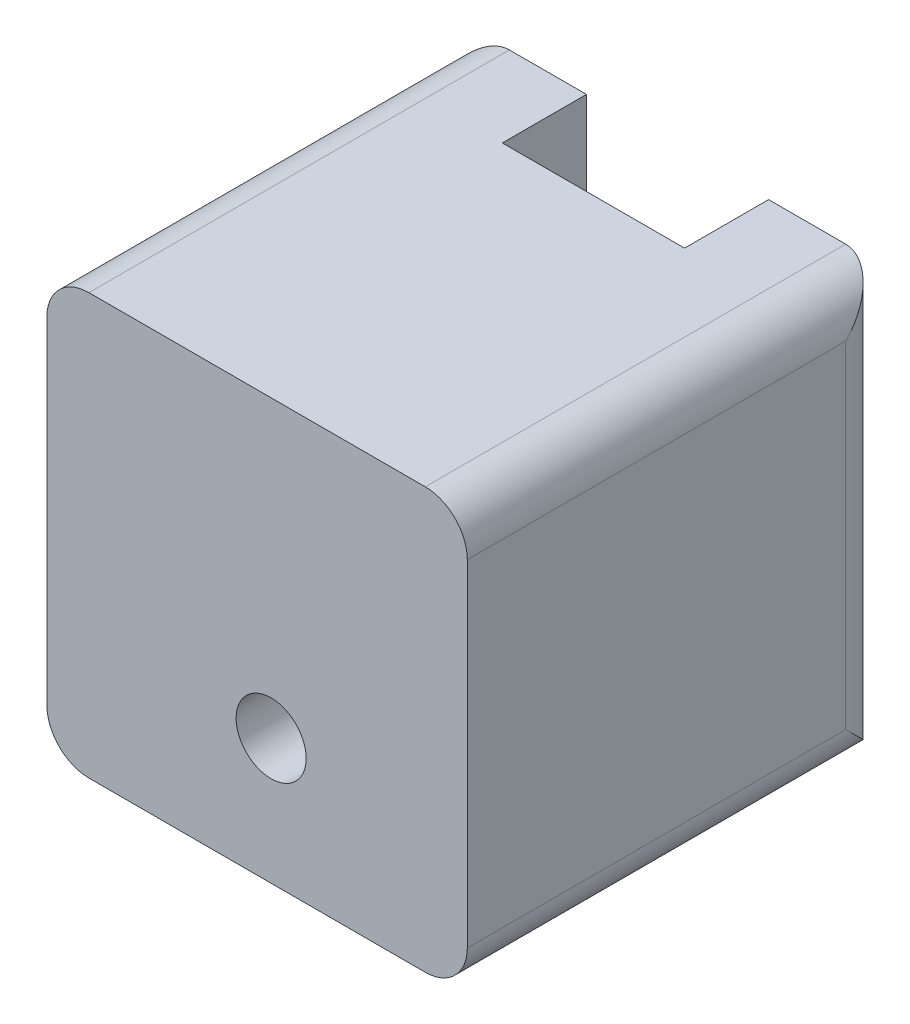
ISO-10303-21;
HEADER;
FILE_DESCRIPTION(('STEP AP214'),'2;1');
FILE_NAME('part.step','',(''),(''),'','','');
FILE_SCHEMA(('AUTOMOTIVE_DESIGN { 1 0 10303 214 1 1 1 1 }'));
ENDSEC;
DATA;
#1=APPLICATION_CONTEXT('core data for automotive mechanical design processes');
#2=APPLICATION_PROTOCOL_DEFINITION('international standard','automotive_design',2000,#1);
#3=PRODUCT_CONTEXT('',#1,'mechanical');
#4=PRODUCT('Part','Part','',(#3));
#5=PRODUCT_RELATED_PRODUCT_CATEGORY('part','',(#4));
#6=PRODUCT_DEFINITION_FORMATION('','',#4);
#7=PRODUCT_DEFINITION_CONTEXT('part definition',#1,'design');
#8=PRODUCT_DEFINITION('design','',#6,#7);
#9=PRODUCT_DEFINITION_SHAPE('','',#8);
#10=(LENGTH_UNIT() NAMED_UNIT(*) SI_UNIT(.MILLI.,.METRE.));
#11=(NAMED_UNIT(*) PLANE_ANGLE_UNIT() SI_UNIT($,.RADIAN.));
#12=(NAMED_UNIT(*) SI_UNIT($,.STERADIAN.) SOLID_ANGLE_UNIT());
#13=UNCERTAINTY_MEASURE_WITH_UNIT(LENGTH_MEASURE(1.E-05),#10,'distance_accuracy_value','');
#14=(GEOMETRIC_REPRESENTATION_CONTEXT(3) GLOBAL_UNCERTAINTY_ASSIGNED_CONTEXT((#13)) GLOBAL_UNIT_ASSIGNED_CONTEXT((#10,
#11,#12)) REPRESENTATION_CONTEXT('',''));
#15=CARTESIAN_POINT('',(0.,0.,0.));
#16=DIRECTION('',(0.,0.,1.));
#17=DIRECTION('',(1.,0.,0.));
#18=AXIS2_PLACEMENT_3D('',#15,#16,#17);
#19=CARTESIAN_POINT('',(0.,0.,0.));
#20=DIRECTION('',(0.,0.,-1.));
#21=DIRECTION('',(-1.,0.,0.));
#22=AXIS2_PLACEMENT_3D('',#19,#20,#21);
#23=PLANE('',#22);
#24=DIRECTION('',(1.,0.,0.));
#25=VECTOR('',#24,1.);
#26=CARTESIAN_POINT('',(0.,-30.,0.));
#27=LINE('',#26,#25);
#28=CARTESIAN_POINT('',(-27.,-30.,0.));
#29=VERTEX_POINT('',#28);
#30=CARTESIAN_POINT('',(-21.5,-30.,0.));
#31=VERTEX_POINT('',#30);
#32=EDGE_CURVE('E229',#29,#31,#27,.T.);
#33=ORIENTED_EDGE('',*,*,#32,.F.);
#34=DIRECTION('',(0.,-1.,0.));
#35=VECTOR('',#34,1.);
#36=CARTESIAN_POINT('',(-27.,0.,0.));
#37=LINE('',#36,#35);
#38=CARTESIAN_POINT('',(-27.,0.,0.));
#39=VERTEX_POINT('',#38);
#40=EDGE_CURVE('E11',#29,#39,#37,.F.);
#41=ORIENTED_EDGE('',*,*,#40,.T.);
#42=DIRECTION('',(-1.,0.,0.));
#43=VECTOR('',#42,1.);
#44=CARTESIAN_POINT('',(0.,0.,0.));
#45=LINE('',#44,#43);
#46=CARTESIAN_POINT('',(-21.5,0.,0.));
#47=VERTEX_POINT('',#46);
#48=EDGE_CURVE('E214',#47,#39,#45,.T.);
#49=ORIENTED_EDGE('',*,*,#48,.F.);
#50=DIRECTION('',(0.,1.,0.));
#51=VECTOR('',#50,1.);
#52=CARTESIAN_POINT('',(-21.5,0.,0.));
#53=LINE('',#52,#51);
#54=EDGE_CURVE('E190',#31,#47,#53,.T.);
#55=ORIENTED_EDGE('',*,*,#54,.F.);
#56=EDGE_LOOP('',(#33,#41,#49,#55));
#57=FACE_BOUND('',#56,.T.);
#58=ADVANCED_FACE('F39',(#57),#23,.T.);
#59=CARTESIAN_POINT('',(0.,0.,30.));
#60=DIRECTION('',(-1.,0.,0.));
#61=DIRECTION('',(0.,0.,1.));
#62=AXIS2_PLACEMENT_3D('',#59,#60,#61);
#63=PLANE('',#62);
#64=DIRECTION('',(0.,1.,0.));
#65=VECTOR('',#64,1.);
#66=CARTESIAN_POINT('',(0.,0.,3.));
#67=LINE('',#66,#65);
#68=CARTESIAN_POINT('',(0.,-27.,3.));
#69=VERTEX_POINT('',#68);
#70=CARTESIAN_POINT('',(0.,-3.,3.));
#71=VERTEX_POINT('',#70);
#72=EDGE_CURVE('E254',#69,#71,#67,.T.);
#73=ORIENTED_EDGE('',*,*,#72,.T.);
#74=DIRECTION('',(0.,0.,-1.));
#75=VECTOR('',#74,1.);
#76=CARTESIAN_POINT('',(0.,-3.,30.));
#77=LINE('',#76,#75);
#78=CARTESIAN_POINT('',(0.,-3.,30.));
#79=VERTEX_POINT('',#78);
#80=EDGE_CURVE('E260',#71,#79,#77,.F.);
#81=ORIENTED_EDGE('',*,*,#80,.T.);
#82=DIRECTION('',(0.,1.,0.));
#83=VECTOR('',#82,1.);
#84=CARTESIAN_POINT('',(0.,0.,30.));
#85=LINE('',#84,#83);
#86=CARTESIAN_POINT('',(0.,-27.,30.));
#87=VERTEX_POINT('',#86);
#88=EDGE_CURVE('E224',#87,#79,#85,.T.);
#89=ORIENTED_EDGE('',*,*,#88,.F.);
#90=DIRECTION('',(0.,0.,-1.));
#91=VECTOR('',#90,1.);
#92=CARTESIAN_POINT('',(0.,-27.,30.));
#93=LINE('',#92,#91);
#94=EDGE_CURVE('E257',#87,#69,#93,.T.);
#95=ORIENTED_EDGE('',*,*,#94,.T.);
#96=EDGE_LOOP('',(#73,#81,#89,#95));
#97=FACE_BOUND('',#96,.T.);
#98=ADVANCED_FACE('F383',(#97),#63,.F.);
#99=CARTESIAN_POINT('',(0.,0.,30.));
#100=DIRECTION('',(0.,-1.,0.));
#101=DIRECTION('',(1.,0.,0.));
#102=AXIS2_PLACEMENT_3D('',#99,#100,#101);
#103=PLANE('',#102);
#104=DIRECTION('',(-1.,0.,0.));
#105=VECTOR('',#104,1.);
#106=CARTESIAN_POINT('',(0.,0.,30.));
#107=LINE('',#106,#105);
#108=CARTESIAN_POINT('',(-3.,0.,30.));
#109=VERTEX_POINT('',#108);
#110=CARTESIAN_POINT('',(-27.,0.,30.));
#111=VERTEX_POINT('',#110);
#112=EDGE_CURVE('E228',#109,#111,#107,.T.);
#113=ORIENTED_EDGE('',*,*,#112,.F.);
#114=DIRECTION('',(0.,0.,-1.));
#115=VECTOR('',#114,1.);
#116=CARTESIAN_POINT('',(-3.,0.,30.));
#117=LINE('',#116,#115);
#118=CARTESIAN_POINT('',(-3.,0.,0.));
#119=VERTEX_POINT('',#118);
#120=EDGE_CURVE('E250',#109,#119,#117,.T.);
#121=ORIENTED_EDGE('',*,*,#120,.T.);
#122=CARTESIAN_POINT('',(-8.5,0.,0.));
#123=VERTEX_POINT('',#122);
#124=EDGE_CURVE('E242',#119,#123,#45,.T.);
#125=ORIENTED_EDGE('',*,*,#124,.T.);
#126=DIRECTION('',(0.,0.,-1.));
#127=VECTOR('',#126,1.);
#128=CARTESIAN_POINT('',(-8.5,0.,6.));
#129=LINE('',#128,#127);
#130=CARTESIAN_POINT('',(-8.5,0.,6.));
#131=VERTEX_POINT('',#130);
#132=EDGE_CURVE('E210',#131,#123,#129,.T.);
#133=ORIENTED_EDGE('',*,*,#132,.F.);
#134=DIRECTION('',(1.,0.,0.));
#135=VECTOR('',#134,1.);
#136=CARTESIAN_POINT('',(-8.5,0.,6.));
#137=LINE('',#136,#135);
#138=CARTESIAN_POINT('',(-21.5,0.,6.));
#139=VERTEX_POINT('',#138);
#140=EDGE_CURVE('E198',#139,#131,#137,.T.);
#141=ORIENTED_EDGE('',*,*,#140,.F.);
#142=DIRECTION('',(0.,0.,-1.));
#143=VECTOR('',#142,1.);
#144=CARTESIAN_POINT('',(-21.5,0.,6.));
#145=LINE('',#144,#143);
#146=EDGE_CURVE('E215',#139,#47,#145,.T.);
#147=ORIENTED_EDGE('',*,*,#146,.T.);
#148=ORIENTED_EDGE('',*,*,#48,.T.);
#149=DIRECTION('',(0.,0.,-1.));
#150=VECTOR('',#149,1.);
#151=CARTESIAN_POINT('',(-27.,0.,30.));
#152=LINE('',#151,#150);
#153=EDGE_CURVE('E241',#39,#111,#152,.F.);
#154=ORIENTED_EDGE('',*,*,#153,.T.);
#155=EDGE_LOOP('',(#113,#121,#125,#133,#141,#147,#148,#154));
#156=FACE_BOUND('',#155,.T.);
#157=ADVANCED_FACE('F325',(#156),#103,.F.);
#158=CARTESIAN_POINT('',(-30.,0.,30.));
#159=DIRECTION('',(1.,0.,0.));
#160=DIRECTION('',(0.,1.,0.));
#161=AXIS2_PLACEMENT_3D('',#158,#159,#160);
#162=PLANE('',#161);
#163=DIRECTION('',(0.,-1.,0.));
#164=VECTOR('',#163,1.);
#165=CARTESIAN_POINT('',(-30.,0.,30.));
#166=LINE('',#165,#164);
#167=CARTESIAN_POINT('',(-30.,-3.,30.));
#168=VERTEX_POINT('',#167);
#169=CARTESIAN_POINT('',(-30.,-27.,30.));
#170=VERTEX_POINT('',#169);
#171=EDGE_CURVE('E233',#168,#170,#166,.T.);
#172=ORIENTED_EDGE('',*,*,#171,.F.);
#173=DIRECTION('',(0.,0.,-1.));
#174=VECTOR('',#173,1.);
#175=CARTESIAN_POINT('',(-30.,-3.,30.));
#176=LINE('',#175,#174);
#177=CARTESIAN_POINT('',(-30.,-3.,3.));
#178=VERTEX_POINT('',#177);
#179=EDGE_CURVE('E281',#168,#178,#176,.T.);
#180=ORIENTED_EDGE('',*,*,#179,.T.);
#181=DIRECTION('',(0.,-1.,0.));
#182=VECTOR('',#181,1.);
#183=CARTESIAN_POINT('',(-30.,-30.,3.));
#184=LINE('',#183,#182);
#185=CARTESIAN_POINT('',(-30.,-27.,3.));
#186=VERTEX_POINT('',#185);
#187=EDGE_CURVE('E275',#178,#186,#184,.T.);
#188=ORIENTED_EDGE('',*,*,#187,.T.);
#189=DIRECTION('',(0.,0.,-1.));
#190=VECTOR('',#189,1.);
#191=CARTESIAN_POINT('',(-30.,-27.,30.));
#192=LINE('',#191,#190);
#193=EDGE_CURVE('E278',#186,#170,#192,.F.);
#194=ORIENTED_EDGE('',*,*,#193,.T.);
#195=EDGE_LOOP('',(#172,#180,#188,#194));
#196=FACE_BOUND('',#195,.T.);
#197=ADVANCED_FACE('F317',(#196),#162,.F.);
#198=CARTESIAN_POINT('',(0.,-30.,30.));
#199=DIRECTION('',(0.,1.,0.));
#200=DIRECTION('',(-1.,0.,0.));
#201=AXIS2_PLACEMENT_3D('',#198,#199,#200);
#202=PLANE('',#201);
#203=CARTESIAN_POINT('',(-18.,-30.,0.));
#204=VERTEX_POINT('',#203);
#205=CARTESIAN_POINT('',(-3.,-30.,0.));
#206=VERTEX_POINT('',#205);
#207=EDGE_CURVE('E245',#204,#206,#27,.T.);
#208=ORIENTED_EDGE('',*,*,#207,.T.);
#209=DIRECTION('',(0.,0.,-1.));
#210=VECTOR('',#209,1.);
#211=CARTESIAN_POINT('',(-3.,-30.,30.));
#212=LINE('',#211,#210);
#213=CARTESIAN_POINT('',(-3.,-30.,30.));
#214=VERTEX_POINT('',#213);
#215=EDGE_CURVE('E287',#206,#214,#212,.F.);
#216=ORIENTED_EDGE('',*,*,#215,.T.);
#217=DIRECTION('',(1.,0.,0.));
#218=VECTOR('',#217,1.);
#219=CARTESIAN_POINT('',(0.,-30.,30.));
#220=LINE('',#219,#218);
#221=CARTESIAN_POINT('',(-27.,-30.,30.));
#222=VERTEX_POINT('',#221);
#223=EDGE_CURVE('E237',#222,#214,#220,.T.);
#224=ORIENTED_EDGE('',*,*,#223,.F.);
#225=DIRECTION('',(0.,0.,-1.));
#226=VECTOR('',#225,1.);
#227=CARTESIAN_POINT('',(-27.,-30.,30.));
#228=LINE('',#227,#226);
#229=EDGE_CURVE('E64',#222,#29,#228,.T.);
#230=ORIENTED_EDGE('',*,*,#229,.T.);
#231=ORIENTED_EDGE('',*,*,#32,.T.);
#232=DIRECTION('',(0.,0.,-1.));
#233=VECTOR('',#232,1.);
#234=CARTESIAN_POINT('',(-21.5,-30.,3.));
#235=LINE('',#234,#233);
#236=CARTESIAN_POINT('',(-21.5,-30.,3.));
#237=VERTEX_POINT('',#236);
#238=EDGE_CURVE('E180',#237,#31,#235,.T.);
#239=ORIENTED_EDGE('',*,*,#238,.F.);
#240=DIRECTION('',(-1.,0.,0.));
#241=VECTOR('',#240,1.);
#242=CARTESIAN_POINT('',(-21.5,-30.,3.));
#243=LINE('',#242,#241);
#244=CARTESIAN_POINT('',(-18.,-30.,3.));
#245=VERTEX_POINT('',#244);
#246=EDGE_CURVE('E161',#245,#237,#243,.T.);
#247=ORIENTED_EDGE('',*,*,#246,.F.);
#248=DIRECTION('',(0.,0.,-1.));
#249=VECTOR('',#248,1.);
#250=CARTESIAN_POINT('',(-18.,-30.,3.));
#251=LINE('',#250,#249);
#252=EDGE_CURVE('E156',#245,#204,#251,.T.);
#253=ORIENTED_EDGE('',*,*,#252,.T.);
#254=EDGE_LOOP('',(#208,#216,#224,#230,#231,#239,#247,#253));
#255=FACE_BOUND('',#254,.T.);
#256=ADVANCED_FACE('F371',(#255),#202,.F.);
#257=CARTESIAN_POINT('',(0.,0.,30.));
#258=DIRECTION('',(0.,0.,-1.));
#259=DIRECTION('',(-1.,0.,0.));
#260=AXIS2_PLACEMENT_3D('',#257,#258,#259);
#261=PLANE('',#260);
#262=CARTESIAN_POINT('',(-14.,-21.0389605122577,30.));
#263=DIRECTION('',(0.,0.,-1.));
#264=DIRECTION('',(-1.,0.,0.));
#265=AXIS2_PLACEMENT_3D('',#262,#263,#264);
#266=CIRCLE('',#265,2.5);
#267=CARTESIAN_POINT('',(-16.5,-21.0389605122577,30.));
#268=VERTEX_POINT('',#267);
#269=EDGE_CURVE('E340',#268,#268,#266,.T.);
#270=ORIENTED_EDGE('',*,*,#269,.T.);
#271=EDGE_LOOP('',(#270));
#272=FACE_BOUND('',#271,.T.);
#273=ORIENTED_EDGE('',*,*,#88,.T.);
#274=CARTESIAN_POINT('',(-3.,-3.,30.));
#275=DIRECTION('',(0.,0.,-1.));
#276=DIRECTION('',(-1.,0.,0.));
#277=AXIS2_PLACEMENT_3D('',#274,#275,#276);
#278=CIRCLE('',#277,3.);
#279=EDGE_CURVE('E272',#79,#109,#278,.F.);
#280=ORIENTED_EDGE('',*,*,#279,.T.);
#281=ORIENTED_EDGE('',*,*,#112,.T.);
#282=CARTESIAN_POINT('',(-27.,-3.,30.));
#283=DIRECTION('',(0.,0.,-1.));
#284=DIRECTION('',(-1.,0.,0.));
#285=AXIS2_PLACEMENT_3D('',#282,#283,#284);
#286=CIRCLE('',#285,3.);
#287=EDGE_CURVE('E269',#111,#168,#286,.F.);
#288=ORIENTED_EDGE('',*,*,#287,.T.);
#289=ORIENTED_EDGE('',*,*,#171,.T.);
#290=CARTESIAN_POINT('',(-27.,-27.,30.));
#291=DIRECTION('',(0.,0.,-1.));
#292=DIRECTION('',(-1.,0.,0.));
#293=AXIS2_PLACEMENT_3D('',#290,#291,#292);
#294=CIRCLE('',#293,3.);
#295=EDGE_CURVE('E263',#170,#222,#294,.F.);
#296=ORIENTED_EDGE('',*,*,#295,.T.);
#297=ORIENTED_EDGE('',*,*,#223,.T.);
#298=CARTESIAN_POINT('',(-3.,-27.,30.));
#299=DIRECTION('',(0.,0.,-1.));
#300=DIRECTION('',(-1.,0.,0.));
#301=AXIS2_PLACEMENT_3D('',#298,#299,#300);
#302=CIRCLE('',#301,3.);
#303=EDGE_CURVE('E266',#214,#87,#302,.F.);
#304=ORIENTED_EDGE('',*,*,#303,.T.);
#305=EDGE_LOOP('',(#273,#280,#281,#288,#289,#296,#297,#304));
#306=FACE_BOUND('',#305,.T.);
#307=ADVANCED_FACE('F319',(#272,#306),#261,.F.);
#308=CARTESIAN_POINT('',(-14.,-21.0389605122577,0.));
#309=DIRECTION('',(0.,0.,-1.));
#310=DIRECTION('',(-1.,0.,0.));
#311=AXIS2_PLACEMENT_3D('',#308,#309,#310);
#312=CIRCLE('',#311,2.5);
#313=CARTESIAN_POINT('',(-16.5,-21.0389605122577,0.));
#314=VERTEX_POINT('',#313);
#315=EDGE_CURVE('E298',#314,#314,#312,.T.);
#316=ORIENTED_EDGE('',*,*,#315,.F.);
#317=EDGE_LOOP('',(#316));
#318=FACE_BOUND('',#317,.T.);
#319=ORIENTED_EDGE('',*,*,#124,.F.);
#320=DIRECTION('',(0.,1.,0.));
#321=VECTOR('',#320,1.);
#322=CARTESIAN_POINT('',(-3.,-30.,0.));
#323=LINE('',#322,#321);
#324=EDGE_CURVE('E49',#119,#206,#323,.F.);
#325=ORIENTED_EDGE('',*,*,#324,.T.);
#326=ORIENTED_EDGE('',*,*,#207,.F.);
#327=DIRECTION('',(0.,-1.,0.));
#328=VECTOR('',#327,1.);
#329=CARTESIAN_POINT('',(-18.,-15.,0.));
#330=LINE('',#329,#328);
#331=CARTESIAN_POINT('',(-18.,-15.,0.));
#332=VERTEX_POINT('',#331);
#333=EDGE_CURVE('E338',#332,#204,#330,.T.);
#334=ORIENTED_EDGE('',*,*,#333,.F.);
#335=DIRECTION('',(-1.,0.,0.));
#336=VECTOR('',#335,1.);
#337=CARTESIAN_POINT('',(-8.5,-15.,0.));
#338=LINE('',#337,#336);
#339=CARTESIAN_POINT('',(-8.5,-15.,0.));
#340=VERTEX_POINT('',#339);
#341=EDGE_CURVE('E175',#340,#332,#338,.T.);
#342=ORIENTED_EDGE('',*,*,#341,.F.);
#343=DIRECTION('',(0.,-1.,0.));
#344=VECTOR('',#343,1.);
#345=CARTESIAN_POINT('',(-8.5,0.,0.));
#346=LINE('',#345,#344);
#347=EDGE_CURVE('E203',#123,#340,#346,.T.);
#348=ORIENTED_EDGE('',*,*,#347,.F.);
#349=EDGE_LOOP('',(#319,#325,#326,#334,#342,#348));
#350=FACE_BOUND('',#349,.T.);
#351=ADVANCED_FACE('F359',(#318,#350),#23,.T.);
#352=CARTESIAN_POINT('',(-8.5,0.,6.));
#353=DIRECTION('',(1.,0.,0.));
#354=DIRECTION('',(0.,1.,0.));
#355=AXIS2_PLACEMENT_3D('',#352,#353,#354);
#356=PLANE('',#355);
#357=ORIENTED_EDGE('',*,*,#347,.T.);
#358=DIRECTION('',(0.,0.,-1.));
#359=VECTOR('',#358,1.);
#360=CARTESIAN_POINT('',(-8.5,-15.,6.));
#361=LINE('',#360,#359);
#362=CARTESIAN_POINT('',(-8.5,-15.,6.));
#363=VERTEX_POINT('',#362);
#364=EDGE_CURVE('E202',#363,#340,#361,.T.);
#365=ORIENTED_EDGE('',*,*,#364,.F.);
#366=DIRECTION('',(0.,-1.,0.));
#367=VECTOR('',#366,1.);
#368=CARTESIAN_POINT('',(-8.5,0.,6.));
#369=LINE('',#368,#367);
#370=EDGE_CURVE('E185',#131,#363,#369,.T.);
#371=ORIENTED_EDGE('',*,*,#370,.F.);
#372=ORIENTED_EDGE('',*,*,#132,.T.);
#373=EDGE_LOOP('',(#357,#365,#371,#372));
#374=FACE_BOUND('',#373,.T.);
#375=ADVANCED_FACE('F361',(#374),#356,.F.);
#376=CARTESIAN_POINT('',(-21.5,0.,6.));
#377=DIRECTION('',(-1.,0.,0.));
#378=DIRECTION('',(0.,-1.,0.));
#379=AXIS2_PLACEMENT_3D('',#376,#377,#378);
#380=PLANE('',#379);
#381=ORIENTED_EDGE('',*,*,#54,.T.);
#382=ORIENTED_EDGE('',*,*,#146,.F.);
#383=DIRECTION('',(0.,1.,0.));
#384=VECTOR('',#383,1.);
#385=CARTESIAN_POINT('',(-21.5,0.,6.));
#386=LINE('',#385,#384);
#387=CARTESIAN_POINT('',(-21.5,-15.,6.));
#388=VERTEX_POINT('',#387);
#389=EDGE_CURVE('E194',#388,#139,#386,.T.);
#390=ORIENTED_EDGE('',*,*,#389,.F.);
#391=DIRECTION('',(0.,0.,-1.));
#392=VECTOR('',#391,1.);
#393=CARTESIAN_POINT('',(-21.5,-15.,6.));
#394=LINE('',#393,#392);
#395=CARTESIAN_POINT('',(-21.5,-15.,3.));
#396=VERTEX_POINT('',#395);
#397=EDGE_CURVE('E219',#388,#396,#394,.T.);
#398=ORIENTED_EDGE('',*,*,#397,.T.);
#399=DIRECTION('',(0.,1.,0.));
#400=VECTOR('',#399,1.);
#401=CARTESIAN_POINT('',(-21.5,-15.,3.));
#402=LINE('',#401,#400);
#403=EDGE_CURVE('E166',#237,#396,#402,.T.);
#404=ORIENTED_EDGE('',*,*,#403,.F.);
#405=ORIENTED_EDGE('',*,*,#238,.T.);
#406=EDGE_LOOP('',(#381,#382,#390,#398,#404,#405));
#407=FACE_BOUND('',#406,.T.);
#408=ADVANCED_FACE('F370',(#407),#380,.F.);
#409=CARTESIAN_POINT('',(-8.5,-15.,6.));
#410=DIRECTION('',(0.,-1.,0.));
#411=DIRECTION('',(1.,0.,0.));
#412=AXIS2_PLACEMENT_3D('',#409,#410,#411);
#413=PLANE('',#412);
#414=ORIENTED_EDGE('',*,*,#341,.T.);
#415=DIRECTION('',(0.,0.,-1.));
#416=VECTOR('',#415,1.);
#417=CARTESIAN_POINT('',(-18.,-15.,3.));
#418=LINE('',#417,#416);
#419=CARTESIAN_POINT('',(-18.,-15.,3.));
#420=VERTEX_POINT('',#419);
#421=EDGE_CURVE('E153',#420,#332,#418,.T.);
#422=ORIENTED_EDGE('',*,*,#421,.F.);
#423=DIRECTION('',(1.,0.,0.));
#424=VECTOR('',#423,1.);
#425=CARTESIAN_POINT('',(-21.5,-15.,3.));
#426=LINE('',#425,#424);
#427=EDGE_CURVE('E162',#396,#420,#426,.T.);
#428=ORIENTED_EDGE('',*,*,#427,.F.);
#429=ORIENTED_EDGE('',*,*,#397,.F.);
#430=DIRECTION('',(-1.,0.,0.));
#431=VECTOR('',#430,1.);
#432=CARTESIAN_POINT('',(-8.5,-15.,6.));
#433=LINE('',#432,#431);
#434=EDGE_CURVE('E189',#363,#388,#433,.T.);
#435=ORIENTED_EDGE('',*,*,#434,.F.);
#436=ORIENTED_EDGE('',*,*,#364,.T.);
#437=EDGE_LOOP('',(#414,#422,#428,#429,#435,#436));
#438=FACE_BOUND('',#437,.T.);
#439=ADVANCED_FACE('F172',(#438),#413,.F.);
#440=CARTESIAN_POINT('',(0.,0.,6.));
#441=DIRECTION('',(0.,0.,-1.));
#442=DIRECTION('',(-1.,0.,0.));
#443=AXIS2_PLACEMENT_3D('',#440,#441,#442);
#444=PLANE('',#443);
#445=ORIENTED_EDGE('',*,*,#370,.T.);
#446=ORIENTED_EDGE('',*,*,#434,.T.);
#447=ORIENTED_EDGE('',*,*,#389,.T.);
#448=ORIENTED_EDGE('',*,*,#140,.T.);
#449=EDGE_LOOP('',(#445,#446,#447,#448));
#450=FACE_BOUND('',#449,.T.);
#451=ADVANCED_FACE('F368',(#450),#444,.T.);
#452=CARTESIAN_POINT('',(-18.,-15.,3.));
#453=DIRECTION('',(1.,0.,0.));
#454=DIRECTION('',(0.,0.,-1.));
#455=AXIS2_PLACEMENT_3D('',#452,#453,#454);
#456=PLANE('',#455);
#457=ORIENTED_EDGE('',*,*,#333,.T.);
#458=ORIENTED_EDGE('',*,*,#252,.F.);
#459=DIRECTION('',(0.,-1.,0.));
#460=VECTOR('',#459,1.);
#461=CARTESIAN_POINT('',(-18.,-15.,3.));
#462=LINE('',#461,#460);
#463=EDGE_CURVE('E149',#420,#245,#462,.T.);
#464=ORIENTED_EDGE('',*,*,#463,.F.);
#465=ORIENTED_EDGE('',*,*,#421,.T.);
#466=EDGE_LOOP('',(#457,#458,#464,#465));
#467=FACE_BOUND('',#466,.T.);
#468=ADVANCED_FACE('F151',(#467),#456,.F.);
#469=CARTESIAN_POINT('',(0.,0.,3.));
#470=DIRECTION('',(0.,0.,1.));
#471=DIRECTION('',(1.,0.,0.));
#472=AXIS2_PLACEMENT_3D('',#469,#470,#471);
#473=PLANE('',#472);
#474=ORIENTED_EDGE('',*,*,#403,.T.);
#475=ORIENTED_EDGE('',*,*,#427,.T.);
#476=ORIENTED_EDGE('',*,*,#463,.T.);
#477=ORIENTED_EDGE('',*,*,#246,.T.);
#478=EDGE_LOOP('',(#474,#475,#476,#477));
#479=FACE_BOUND('',#478,.T.);
#480=ADVANCED_FACE('F165',(#479),#473,.F.);
#481=CARTESIAN_POINT('',(-14.,-21.0389605122577,30.));
#482=DIRECTION('',(0.,0.,-1.));
#483=DIRECTION('',(-1.,0.,0.));
#484=AXIS2_PLACEMENT_3D('',#481,#482,#483);
#485=CYLINDRICAL_SURFACE('',#484,2.5);
#486=ORIENTED_EDGE('',*,*,#269,.F.);
#487=EDGE_LOOP('',(#486));
#488=FACE_BOUND('',#487,.T.);
#489=ORIENTED_EDGE('',*,*,#315,.T.);
#490=EDGE_LOOP('',(#489));
#491=FACE_BOUND('',#490,.T.);
#492=ADVANCED_FACE('F352',(#488,#491),#485,.F.);
#493=CARTESIAN_POINT('',(-3.,-27.,30.));
#494=DIRECTION('',(0.,0.,-1.));
#495=DIRECTION('',(-1.,0.,0.));
#496=AXIS2_PLACEMENT_3D('',#493,#494,#495);
#497=CYLINDRICAL_SURFACE('',#496,3.);
#498=ORIENTED_EDGE('',*,*,#303,.F.);
#499=ORIENTED_EDGE('',*,*,#215,.F.);
#500=CARTESIAN_POINT('',(-3.,-27.,3.));
#501=DIRECTION('',(0.,-0.707106781186547,0.707106781186547));
#502=DIRECTION('',(0.,-0.707106781186547,-0.707106781186547));
#503=AXIS2_PLACEMENT_3D('',#500,#501,#502);
#504=ELLIPSE('',#503,4.24264068711928,3.);
#505=EDGE_CURVE('E295',#69,#206,#504,.F.);
#506=ORIENTED_EDGE('',*,*,#505,.F.);
#507=ORIENTED_EDGE('',*,*,#94,.F.);
#508=EDGE_LOOP('',(#498,#499,#506,#507));
#509=FACE_BOUND('',#508,.T.);
#510=ADVANCED_FACE('F355',(#509),#497,.T.);
#511=CARTESIAN_POINT('',(-3.,0.,3.));
#512=DIRECTION('',(0.,-1.,0.));
#513=DIRECTION('',(0.,0.,-1.));
#514=AXIS2_PLACEMENT_3D('',#511,#512,#513);
#515=CYLINDRICAL_SURFACE('',#514,3.);
#516=ORIENTED_EDGE('',*,*,#505,.T.);
#517=ORIENTED_EDGE('',*,*,#324,.F.);
#518=CARTESIAN_POINT('',(-3.,-3.,3.));
#519=DIRECTION('',(0.,-0.707106781186547,-0.707106781186547));
#520=DIRECTION('',(0.,-0.707106781186547,0.707106781186547));
#521=AXIS2_PLACEMENT_3D('',#518,#519,#520);
#522=ELLIPSE('',#521,4.24264068711928,3.);
#523=EDGE_CURVE('E292',#71,#119,#522,.F.);
#524=ORIENTED_EDGE('',*,*,#523,.F.);
#525=ORIENTED_EDGE('',*,*,#72,.F.);
#526=EDGE_LOOP('',(#516,#517,#524,#525));
#527=FACE_BOUND('',#526,.T.);
#528=ADVANCED_FACE('F379',(#527),#515,.T.);
#529=CARTESIAN_POINT('',(-3.,-3.,30.));
#530=DIRECTION('',(0.,0.,-1.));
#531=DIRECTION('',(-1.,0.,0.));
#532=AXIS2_PLACEMENT_3D('',#529,#530,#531);
#533=CYLINDRICAL_SURFACE('',#532,3.);
#534=ORIENTED_EDGE('',*,*,#279,.F.);
#535=ORIENTED_EDGE('',*,*,#80,.F.);
#536=ORIENTED_EDGE('',*,*,#523,.T.);
#537=ORIENTED_EDGE('',*,*,#120,.F.);
#538=EDGE_LOOP('',(#534,#535,#536,#537));
#539=FACE_BOUND('',#538,.T.);
#540=ADVANCED_FACE('F387',(#539),#533,.T.);
#541=CARTESIAN_POINT('',(-27.,-27.,30.));
#542=DIRECTION('',(0.,0.,-1.));
#543=DIRECTION('',(-1.,0.,0.));
#544=AXIS2_PLACEMENT_3D('',#541,#542,#543);
#545=CYLINDRICAL_SURFACE('',#544,3.);
#546=ORIENTED_EDGE('',*,*,#295,.F.);
#547=ORIENTED_EDGE('',*,*,#193,.F.);
#548=CARTESIAN_POINT('',(-27.,-27.,3.));
#549=DIRECTION('',(0.,0.707106781186547,-0.707106781186547));
#550=DIRECTION('',(0.,0.707106781186547,0.707106781186547));
#551=AXIS2_PLACEMENT_3D('',#548,#549,#550);
#552=ELLIPSE('',#551,4.24264068711928,3.);
#553=EDGE_CURVE('E43',#29,#186,#552,.T.);
#554=ORIENTED_EDGE('',*,*,#553,.F.);
#555=ORIENTED_EDGE('',*,*,#229,.F.);
#556=EDGE_LOOP('',(#546,#547,#554,#555));
#557=FACE_BOUND('',#556,.T.);
#558=ADVANCED_FACE('F41',(#557),#545,.T.);
#559=CARTESIAN_POINT('',(-27.,0.,3.));
#560=DIRECTION('',(0.,1.,0.));
#561=DIRECTION('',(-1.,0.,0.));
#562=AXIS2_PLACEMENT_3D('',#559,#560,#561);
#563=CYLINDRICAL_SURFACE('',#562,3.);
#564=ORIENTED_EDGE('',*,*,#553,.T.);
#565=ORIENTED_EDGE('',*,*,#187,.F.);
#566=CARTESIAN_POINT('',(-27.,-3.,3.));
#567=DIRECTION('',(0.,0.707106781186547,0.707106781186547));
#568=DIRECTION('',(0.,0.707106781186547,-0.707106781186547));
#569=AXIS2_PLACEMENT_3D('',#566,#567,#568);
#570=ELLIPSE('',#569,4.24264068711928,3.);
#571=EDGE_CURVE('E299',#39,#178,#570,.T.);
#572=ORIENTED_EDGE('',*,*,#571,.F.);
#573=ORIENTED_EDGE('',*,*,#40,.F.);
#574=EDGE_LOOP('',(#564,#565,#572,#573));
#575=FACE_BOUND('',#574,.T.);
#576=ADVANCED_FACE('F311',(#575),#563,.T.);
#577=CARTESIAN_POINT('',(-27.,-3.,30.));
#578=DIRECTION('',(0.,0.,-1.));
#579=DIRECTION('',(-1.,0.,0.));
#580=AXIS2_PLACEMENT_3D('',#577,#578,#579);
#581=CYLINDRICAL_SURFACE('',#580,3.);
#582=ORIENTED_EDGE('',*,*,#287,.F.);
#583=ORIENTED_EDGE('',*,*,#153,.F.);
#584=ORIENTED_EDGE('',*,*,#571,.T.);
#585=ORIENTED_EDGE('',*,*,#179,.F.);
#586=EDGE_LOOP('',(#582,#583,#584,#585));
#587=FACE_BOUND('',#586,.T.);
#588=ADVANCED_FACE('F322',(#587),#581,.T.);
#589=CLOSED_SHELL('',(#58,#98,#157,#197,#256,#307,#351,#375,#408,#439,#451,#468,#480,#492,#510,
#528,#540,#558,#576,#588));
#590=MANIFOLD_SOLID_BREP('B2',#589);
#591=ADVANCED_BREP_SHAPE_REPRESENTATION('',(#18,#590),#14);
#592=SHAPE_DEFINITION_REPRESENTATION(#9,#591);
ENDSEC;
END-ISO-10303-21;
